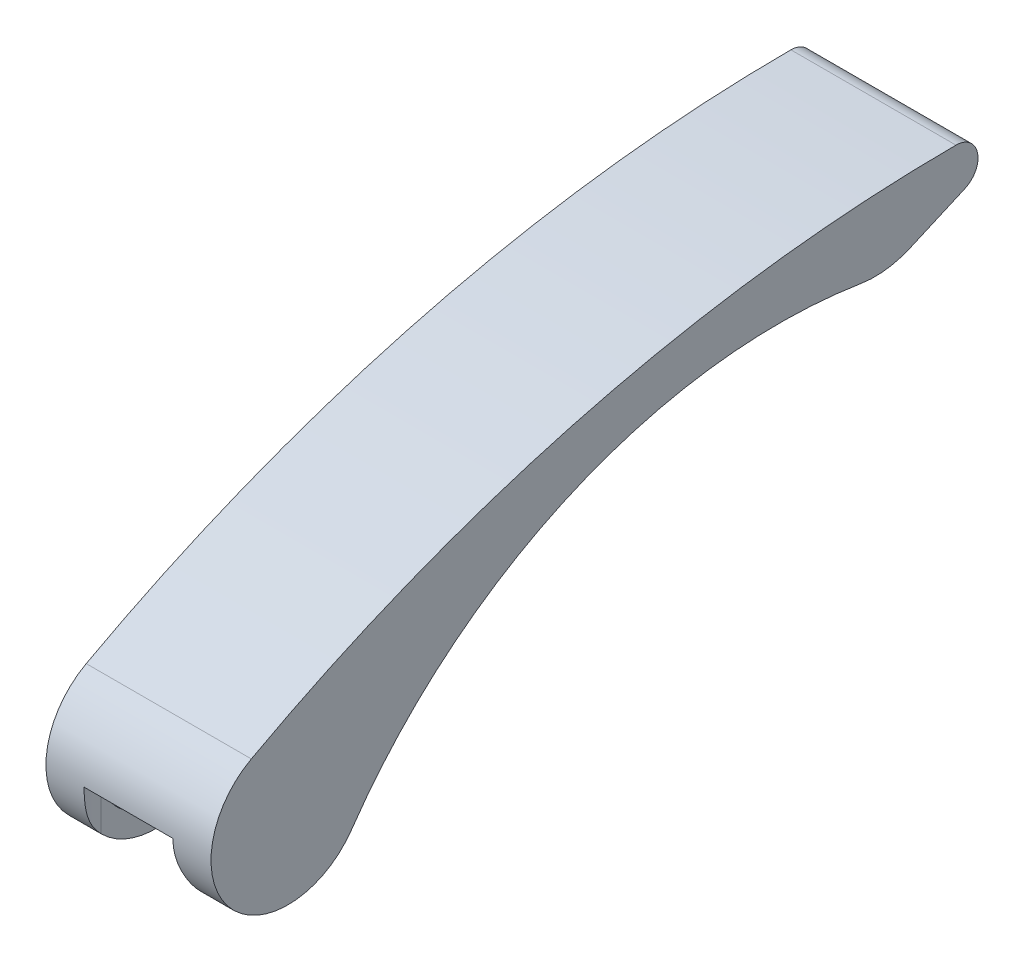
ISO-10303-21;
HEADER;
FILE_DESCRIPTION(('STEP AP214'),'2;1');
FILE_NAME('part.step','',(''),(''),'','','');
FILE_SCHEMA(('AUTOMOTIVE_DESIGN { 1 0 10303 214 1 1 1 1 }'));
ENDSEC;
DATA;
#1=APPLICATION_CONTEXT('core data for automotive mechanical design processes');
#2=APPLICATION_PROTOCOL_DEFINITION('international standard','automotive_design',2000,#1);
#3=PRODUCT_CONTEXT('',#1,'mechanical');
#4=PRODUCT('Part','Part','',(#3));
#5=PRODUCT_RELATED_PRODUCT_CATEGORY('part','',(#4));
#6=PRODUCT_DEFINITION_FORMATION('','',#4);
#7=PRODUCT_DEFINITION_CONTEXT('part definition',#1,'design');
#8=PRODUCT_DEFINITION('design','',#6,#7);
#9=PRODUCT_DEFINITION_SHAPE('','',#8);
#10=(LENGTH_UNIT() NAMED_UNIT(*) SI_UNIT(.MILLI.,.METRE.));
#11=(NAMED_UNIT(*) PLANE_ANGLE_UNIT() SI_UNIT($,.RADIAN.));
#12=(NAMED_UNIT(*) SI_UNIT($,.STERADIAN.) SOLID_ANGLE_UNIT());
#13=UNCERTAINTY_MEASURE_WITH_UNIT(LENGTH_MEASURE(1.E-05),#10,'distance_accuracy_value','');
#14=(GEOMETRIC_REPRESENTATION_CONTEXT(3) GLOBAL_UNCERTAINTY_ASSIGNED_CONTEXT((#13)) GLOBAL_UNIT_ASSIGNED_CONTEXT((#10,
#11,#12)) REPRESENTATION_CONTEXT('',''));
#15=CARTESIAN_POINT('',(0.,0.,0.));
#16=DIRECTION('',(0.,0.,1.));
#17=DIRECTION('',(1.,0.,0.));
#18=AXIS2_PLACEMENT_3D('',#15,#16,#17);
#19=CARTESIAN_POINT('',(7.5,0.,0.));
#20=DIRECTION('',(-1.,0.,0.));
#21=DIRECTION('',(0.,0.,1.));
#22=AXIS2_PLACEMENT_3D('',#19,#20,#21);
#23=CYLINDRICAL_SURFACE('',#22,2.5);
#24=CARTESIAN_POINT('',(6.,0.,0.));
#25=DIRECTION('',(-1.,0.,0.));
#26=DIRECTION('',(0.,0.,1.));
#27=AXIS2_PLACEMENT_3D('',#24,#25,#26);
#28=CIRCLE('',#27,2.5);
#29=CARTESIAN_POINT('',(6.,0.,-2.5));
#30=VERTEX_POINT('',#29);
#31=CARTESIAN_POINT('',(6.,0.,2.5));
#32=VERTEX_POINT('',#31);
#33=EDGE_CURVE('E137',#30,#32,#28,.T.);
#34=ORIENTED_EDGE('',*,*,#33,.T.);
#35=DIRECTION('',(-1.,0.,0.));
#36=VECTOR('',#35,1.);
#37=CARTESIAN_POINT('',(7.5,0.,2.5));
#38=LINE('',#37,#36);
#39=CARTESIAN_POINT('',(1.5,0.,2.5));
#40=VERTEX_POINT('',#39);
#41=EDGE_CURVE('E45',#32,#40,#38,.T.);
#42=ORIENTED_EDGE('',*,*,#41,.T.);
#43=CARTESIAN_POINT('',(1.5,0.,0.));
#44=DIRECTION('',(-1.,0.,0.));
#45=DIRECTION('',(0.,0.,1.));
#46=AXIS2_PLACEMENT_3D('',#43,#44,#45);
#47=CIRCLE('',#46,2.5);
#48=CARTESIAN_POINT('',(1.5,0.,-2.5));
#49=VERTEX_POINT('',#48);
#50=EDGE_CURVE('E163',#49,#40,#47,.T.);
#51=ORIENTED_EDGE('',*,*,#50,.F.);
#52=DIRECTION('',(-1.,0.,0.));
#53=VECTOR('',#52,1.);
#54=CARTESIAN_POINT('',(7.5,0.,-2.5));
#55=LINE('',#54,#53);
#56=EDGE_CURVE('E162',#49,#30,#55,.F.);
#57=ORIENTED_EDGE('',*,*,#56,.T.);
#58=EDGE_LOOP('',(#34,#42,#51,#57));
#59=FACE_BOUND('',#58,.T.);
#60=CARTESIAN_POINT('',(0.5,0.,0.));
#61=DIRECTION('',(1.,0.,0.));
#62=DIRECTION('',(0.,0.,-1.));
#63=AXIS2_PLACEMENT_3D('',#60,#61,#62);
#64=CIRCLE('',#63,2.5);
#65=CARTESIAN_POINT('',(0.5,0.,-2.5));
#66=VERTEX_POINT('',#65);
#67=EDGE_CURVE('E11',#66,#66,#64,.T.);
#68=ORIENTED_EDGE('',*,*,#67,.F.);
#69=EDGE_LOOP('',(#68));
#70=FACE_BOUND('',#69,.T.);
#71=CARTESIAN_POINT('',(7.,0.,0.));
#72=DIRECTION('',(1.,0.,0.));
#73=DIRECTION('',(0.,0.,-1.));
#74=AXIS2_PLACEMENT_3D('',#71,#72,#73);
#75=CIRCLE('',#74,2.5);
#76=CARTESIAN_POINT('',(7.,0.,-2.5));
#77=VERTEX_POINT('',#76);
#78=EDGE_CURVE('E329',#77,#77,#75,.T.);
#79=ORIENTED_EDGE('',*,*,#78,.T.);
#80=EDGE_LOOP('',(#79));
#81=FACE_BOUND('',#80,.T.);
#82=ADVANCED_FACE('F38',(#59,#70,#81),#23,.F.);
#83=CARTESIAN_POINT('',(7.5,0.,0.));
#84=DIRECTION('',(-1.,0.,0.));
#85=DIRECTION('',(0.,0.,1.));
#86=AXIS2_PLACEMENT_3D('',#83,#84,#85);
#87=CYLINDRICAL_SURFACE('',#86,3.50000000000001);
#88=CARTESIAN_POINT('',(1.5,-2.4494897427832,-2.5));
#89=CARTESIAN_POINT('',(1.50000055449243,-2.41359681335086,-2.5351700125889));
#90=CARTESIAN_POINT('',(1.50082451074234,-2.37694917305872,-2.56955989302334));
#91=CARTESIAN_POINT('',(1.50390141398077,-2.30233171537012,-2.63662204742708));
#92=CARTESIAN_POINT('',(1.50615088927806,-2.26436532137958,-2.66929828602822));
#93=CARTESIAN_POINT('',(1.51186295284461,-2.18712452422064,-2.73294552135876));
#94=CARTESIAN_POINT('',(1.51532547748346,-2.14785018975793,-2.76391660743322));
#95=CARTESIAN_POINT('',(1.52326815875585,-2.0679792368563,-2.82417629338434));
#96=CARTESIAN_POINT('',(1.52775076945461,-2.02737963529577,-2.85346061888814));
#97=CARTESIAN_POINT('',(1.53263650312109,-1.98620701639347,-2.8818365130641));
#98=B_SPLINE_CURVE_WITH_KNOTS('',3,(#88,#89,#90,#91,#92,#93,#94,#95,#96,#97),.UNSPECIFIED.,.F.,
.F.,(4,2,2,2,4),(0.,0.150726786481212,0.301087898176149,0.451441123871879,0.602159958095219),.UNSPECIFIED.);
#99=CARTESIAN_POINT('',(1.5,-2.4494897427832,-2.5));
#100=VERTEX_POINT('',#99);
#101=CARTESIAN_POINT('',(1.53263650312109,-1.98620701639347,-2.88183651306409));
#102=VERTEX_POINT('',#101);
#103=EDGE_CURVE('E203',#100,#102,#98,.T.);
#104=ORIENTED_EDGE('',*,*,#103,.F.);
#105=CARTESIAN_POINT('',(1.5,0.,0.));
#106=DIRECTION('',(-1.,0.,0.));
#107=DIRECTION('',(0.,0.,1.));
#108=AXIS2_PLACEMENT_3D('',#105,#106,#107);
#109=CIRCLE('',#108,3.50000000000001);
#110=CARTESIAN_POINT('',(1.5,-2.4494897427832,2.5));
#111=VERTEX_POINT('',#110);
#112=EDGE_CURVE('E311',#100,#111,#109,.T.);
#113=ORIENTED_EDGE('',*,*,#112,.T.);
#114=CARTESIAN_POINT('',(1.5,-2.4494897427832,2.5));
#115=CARTESIAN_POINT('',(1.50001150747874,-2.38095175548116,2.56717207436332));
#116=CARTESIAN_POINT('',(1.50300614509939,-2.30969610771905,2.63144440315893));
#117=CARTESIAN_POINT('',(1.51350734589181,-2.16244489518069,2.75371621954298));
#118=CARTESIAN_POINT('',(1.52100802104423,-2.08645563174073,2.81172377678419));
#119=CARTESIAN_POINT('',(1.53908086900067,-1.93019602662413,2.92120823654826));
#120=CARTESIAN_POINT('',(1.54965518951992,-1.84992272359693,2.97268053628989));
#121=CARTESIAN_POINT('',(1.57252869304207,-1.68564735207375,3.06882128421515));
#122=CARTESIAN_POINT('',(1.58482836705843,-1.6016442267858,3.11348778798106));
#123=CARTESIAN_POINT('',(1.62117544461668,-1.35282688823627,3.23304061150738));
#124=CARTESIAN_POINT('',(1.64580197505319,-1.18353586605966,3.298794881576));
#125=CARTESIAN_POINT('',(1.67785805000349,-0.923372687467986,3.37721661480882));
#126=CARTESIAN_POINT('',(1.68772324073695,-0.835689768159784,3.39997830220252));
#127=CARTESIAN_POINT('',(1.70504254564283,-0.658596393423089,3.43866987405277));
#128=CARTESIAN_POINT('',(1.71249767378733,-0.569186681321147,3.4546026325279));
#129=CARTESIAN_POINT('',(1.72362782614906,-0.399956808939108,3.47799274366245));
#130=CARTESIAN_POINT('',(1.72764796650892,-0.320266635163747,3.48623504444791));
#131=CARTESIAN_POINT('',(1.73306822255631,-0.160389663117444,3.49724328185141));
#132=CARTESIAN_POINT('',(1.73446728609904,-0.0802026783710895,3.5000070193068));
#133=CARTESIAN_POINT('',(1.73443556292537,0.,3.50000000000001));
#134=B_SPLINE_CURVE_WITH_KNOTS('',3,(#114,#115,#116,#117,#118,#119,#120,#121,#122,#123,#124,
#125,#126,#127,#128,#129,#130,#131,#132,#133),.UNSPECIFIED.,.F.,.F.,(4,2,2,2,2,2,2,2,2,4),(0.,
0.287643956036813,0.574912864047961,0.862382986258047,1.14993508537866,1.69714145381936,
1.97028821201802,2.24331990070184,2.48374413357205,2.7242648561567),.UNSPECIFIED.);
#135=CARTESIAN_POINT('',(1.73443556292537,0.,3.50000000000001));
#136=VERTEX_POINT('',#135);
#137=EDGE_CURVE('E263',#111,#136,#134,.T.);
#138=ORIENTED_EDGE('',*,*,#137,.T.);
#139=DIRECTION('',(-1.,0.,0.));
#140=VECTOR('',#139,1.);
#141=CARTESIAN_POINT('',(7.5,0.,3.50000000000001));
#142=LINE('',#141,#140);
#143=CARTESIAN_POINT('',(5.76556443707463,0.,3.50000000000001));
#144=VERTEX_POINT('',#143);
#145=EDGE_CURVE('E318',#144,#136,#142,.T.);
#146=ORIENTED_EDGE('',*,*,#145,.F.);
#147=CARTESIAN_POINT('',(5.76556443707463,0.,3.50000000000001));
#148=CARTESIAN_POINT('',(5.76556133534909,-0.0479260870665794,3.5000003669017));
#149=CARTESIAN_POINT('',(5.76605323889517,-0.0958454274084267,3.49901543521711));
#150=CARTESIAN_POINT('',(5.76799917922322,-0.191579894438586,3.49508112433821));
#151=CARTESIAN_POINT('',(5.76945313518614,-0.239395029542365,3.49213191015704));
#152=CARTESIAN_POINT('',(5.77521239050766,-0.382460549829141,3.48035501718148));
#153=CARTESIAN_POINT('',(5.78091518903482,-0.477431434342712,3.46859805913467));
#154=CARTESIAN_POINT('',(5.79549291115375,-0.665784628060411,3.4374179438071));
#155=CARTESIAN_POINT('',(5.80436604678452,-0.759167801644737,3.4179991069198));
#156=CARTESIAN_POINT('',(5.82443589802595,-0.943798363649761,3.37169206727653));
#157=CARTESIAN_POINT('',(5.83563293884035,-1.03504545115901,3.34480281894409));
#158=CARTESIAN_POINT('',(5.87032131704144,-1.2981974491666,3.25547777048318));
#159=CARTESIAN_POINT('',(5.89560113820167,-1.46660330151287,3.18317404250383));
#160=CARTESIAN_POINT('',(5.94248159644596,-1.79013745271599,3.01308612483012));
#161=CARTESIAN_POINT('',(5.96409150389626,-1.94529869905117,2.91536776516884));
#162=CARTESIAN_POINT('',(5.98553659621499,-2.15495204469237,2.75904295910474));
#163=CARTESIAN_POINT('',(5.99075429973335,-2.21620331139955,2.71009056157111));
#164=CARTESIAN_POINT('',(5.99798399917585,-2.33540400332939,2.60807367579205));
#165=CARTESIAN_POINT('',(5.99999504794763,-2.39335244812302,2.55500797744894));
#166=CARTESIAN_POINT('',(6.,-2.4494897427832,2.5));
#167=B_SPLINE_CURVE_WITH_KNOTS('',3,(#147,#148,#149,#150,#151,#152,#153,#154,#155,#156,#157,
#158,#159,#160,#161,#162,#163,#164,#165,#166),.UNSPECIFIED.,.F.,.F.,(4,2,2,2,2,2,2,2,2,4),(0.,
0.143752414921032,0.287492755181155,0.574673420829799,0.861692381449498,1.14875153417803,
1.70145191068032,2.25273467600519,2.48827314378283,2.72388116988002),.UNSPECIFIED.);
#168=CARTESIAN_POINT('',(6.,-2.4494897427832,2.5));
#169=VERTEX_POINT('',#168);
#170=EDGE_CURVE('E159',#144,#169,#167,.T.);
#171=ORIENTED_EDGE('',*,*,#170,.T.);
#172=CARTESIAN_POINT('',(6.,0.,0.));
#173=DIRECTION('',(-1.,0.,0.));
#174=DIRECTION('',(0.,0.,1.));
#175=AXIS2_PLACEMENT_3D('',#172,#173,#174);
#176=CIRCLE('',#175,3.50000000000001);
#177=CARTESIAN_POINT('',(6.,-2.4494897427832,-2.5));
#178=VERTEX_POINT('',#177);
#179=EDGE_CURVE('E140',#178,#169,#176,.T.);
#180=ORIENTED_EDGE('',*,*,#179,.F.);
#181=CARTESIAN_POINT('',(5.96736349687891,-1.98620701639347,-2.8818365130641));
#182=CARTESIAN_POINT('',(5.97224923054539,-2.02737963529577,-2.85346061888814));
#183=CARTESIAN_POINT('',(5.97673184124415,-2.0679792368563,-2.82417629338434));
#184=CARTESIAN_POINT('',(5.98467452251653,-2.14785018975793,-2.76391660743322));
#185=CARTESIAN_POINT('',(5.98813704715539,-2.18712452422064,-2.73294552135876));
#186=CARTESIAN_POINT('',(5.99384911072194,-2.26436532137958,-2.66929828602822));
#187=CARTESIAN_POINT('',(5.99609858601923,-2.30233171537012,-2.63662204742708));
#188=CARTESIAN_POINT('',(5.99917548925766,-2.37694917305872,-2.56955989302334));
#189=CARTESIAN_POINT('',(5.99999944550757,-2.41359681335086,-2.5351700125889));
#190=CARTESIAN_POINT('',(6.,-2.4494897427832,-2.5));
#191=B_SPLINE_CURVE_WITH_KNOTS('',3,(#181,#182,#183,#184,#185,#186,#187,#188,#189,#190),
.UNSPECIFIED.,.F.,.F.,(4,2,2,2,4),(0.,0.15071883422334,0.30107205991907,0.451433171614007,
0.60215995809522),.UNSPECIFIED.);
#192=CARTESIAN_POINT('',(5.96736349687891,-1.98620701639347,-2.88183651306409));
#193=VERTEX_POINT('',#192);
#194=EDGE_CURVE('E255',#193,#178,#191,.T.);
#195=ORIENTED_EDGE('',*,*,#194,.F.);
#196=DIRECTION('',(-1.,0.,0.));
#197=VECTOR('',#196,1.);
#198=CARTESIAN_POINT('',(7.5,-1.98620701639347,-2.8818365130641));
#199=LINE('',#198,#197);
#200=CARTESIAN_POINT('',(7.5,-1.98620701639347,-2.8818365130641));
#201=VERTEX_POINT('',#200);
#202=EDGE_CURVE('E175',#201,#193,#199,.T.);
#203=ORIENTED_EDGE('',*,*,#202,.F.);
#204=CARTESIAN_POINT('',(7.5,0.,0.));
#205=DIRECTION('',(1.,0.,0.));
#206=DIRECTION('',(0.,0.,-1.));
#207=AXIS2_PLACEMENT_3D('',#204,#205,#206);
#208=CIRCLE('',#207,3.50000000000001);
#209=CARTESIAN_POINT('',(7.5,3.07672550411426,1.66846041976817));
#210=VERTEX_POINT('',#209);
#211=EDGE_CURVE('E208',#210,#201,#208,.T.);
#212=ORIENTED_EDGE('',*,*,#211,.F.);
#213=DIRECTION('',(-1.,0.,0.));
#214=VECTOR('',#213,1.);
#215=CARTESIAN_POINT('',(7.5,3.07672550411426,1.66846041976817));
#216=LINE('',#215,#214);
#217=CARTESIAN_POINT('',(0.,3.07672550411426,1.66846041976817));
#218=VERTEX_POINT('',#217);
#219=EDGE_CURVE('E173',#210,#218,#216,.T.);
#220=ORIENTED_EDGE('',*,*,#219,.T.);
#221=CARTESIAN_POINT('',(0.,0.,0.));
#222=DIRECTION('',(1.,0.,0.));
#223=DIRECTION('',(0.,0.,-1.));
#224=AXIS2_PLACEMENT_3D('',#221,#222,#223);
#225=CIRCLE('',#224,3.50000000000001);
#226=CARTESIAN_POINT('',(0.,-1.98620701639347,-2.8818365130641));
#227=VERTEX_POINT('',#226);
#228=EDGE_CURVE('E191',#218,#227,#225,.T.);
#229=ORIENTED_EDGE('',*,*,#228,.T.);
#230=EDGE_CURVE('E178',#102,#227,#199,.T.);
#231=ORIENTED_EDGE('',*,*,#230,.F.);
#232=EDGE_LOOP('',(#104,#113,#138,#146,#171,#180,#195,#203,#212,#220,#229,#231));
#233=FACE_BOUND('',#232,.T.);
#234=ADVANCED_FACE('F231',(#233),#87,.T.);
#235=CARTESIAN_POINT('',(7.5,-15.384281348795,-22.3214314279843));
#236=DIRECTION('',(-1.,0.,0.));
#237=DIRECTION('',(0.,0.,1.));
#238=AXIS2_PLACEMENT_3D('',#235,#236,#237);
#239=CYLINDRICAL_SURFACE('',#238,23.6094524771912);
#240=CARTESIAN_POINT('',(1.53263650312109,-1.98620701639347,-2.88183651306409));
#241=CARTESIAN_POINT('',(1.540140264362,-1.92300970987465,-2.92539260466286));
#242=CARTESIAN_POINT('',(1.5489985173852,-1.86013813480697,-2.96917994973302));
#243=CARTESIAN_POINT('',(1.56960387392771,-1.73512074665356,-3.05715089198465));
#244=CARTESIAN_POINT('',(1.58135190783629,-1.67297517407375,-3.10133461235939));
#245=CARTESIAN_POINT('',(1.62131312644083,-1.48723765518741,-3.23474229161936));
#246=CARTESIAN_POINT('',(1.6541784153758,-1.3649224574917,-3.32442447625919));
#247=CARTESIAN_POINT('',(1.73223568860795,-1.13017613835719,-3.49997390014202));
#248=CARTESIAN_POINT('',(1.77683029448766,-1.01754646010371,-3.58583765642228));
#249=CARTESIAN_POINT('',(1.88055923373326,-0.798283159887392,-3.75603013859139));
#250=CARTESIAN_POINT('',(1.93966452602176,-0.691638078028816,-3.84036157351806));
#251=CARTESIAN_POINT('',(2.07852583315502,-0.480153244029879,-4.01043475838849));
#252=CARTESIAN_POINT('',(2.15928913791531,-0.375785627147139,-4.09596948619845));
#253=CARTESIAN_POINT('',(2.29716959556124,-0.227756564578017,-4.21921355132566));
#254=CARTESIAN_POINT('',(2.3465739992433,-0.179339037949922,-4.25987996082625));
#255=CARTESIAN_POINT('',(2.45121881991692,-0.0864760212990655,-4.33846359279002));
#256=CARTESIAN_POINT('',(2.50647168179277,-0.0420393885403822,-4.37637465106168));
#257=CARTESIAN_POINT('',(2.56472504343442,0.,-4.41249137967696));
#258=B_SPLINE_CURVE_WITH_KNOTS('',3,(#240,#241,#242,#243,#244,#245,#246,#247,#248,#249,#250,
#251,#252,#253,#254,#255,#256,#257),.UNSPECIFIED.,.F.,.F.,(4,2,2,2,2,2,2,2,4),(0.,
0.231331018278143,0.462736613233833,0.927655460684646,1.37238163669543,1.8162249102032,
2.28608137070408,2.52648808704797,2.76741705799169),.UNSPECIFIED.);
#259=CARTESIAN_POINT('',(2.56472504343448,0.,-4.41249137967694));
#260=VERTEX_POINT('',#259);
#261=EDGE_CURVE('E224',#102,#260,#258,.T.);
#262=ORIENTED_EDGE('',*,*,#261,.F.);
#263=ORIENTED_EDGE('',*,*,#230,.T.);
#264=CARTESIAN_POINT('',(0.,-15.384281348795,-22.3214314279843));
#265=DIRECTION('',(1.,0.,0.));
#266=DIRECTION('',(0.,0.,-1.));
#267=AXIS2_PLACEMENT_3D('',#264,#265,#266);
#268=CIRCLE('',#267,23.6094524771912);
#269=CARTESIAN_POINT('',(0.,7.9312784084232,-26.0350441542036));
#270=VERTEX_POINT('',#269);
#271=EDGE_CURVE('E188',#227,#270,#268,.F.);
#272=ORIENTED_EDGE('',*,*,#271,.T.);
#273=DIRECTION('',(-1.,0.,0.));
#274=VECTOR('',#273,1.);
#275=CARTESIAN_POINT('',(7.5,7.9312784084232,-26.0350441542036));
#276=LINE('',#275,#274);
#277=CARTESIAN_POINT('',(7.5,7.9312784084232,-26.0350441542036));
#278=VERTEX_POINT('',#277);
#279=EDGE_CURVE('E179',#278,#270,#276,.T.);
#280=ORIENTED_EDGE('',*,*,#279,.F.);
#281=CARTESIAN_POINT('',(7.5,-15.384281348795,-22.3214314279843));
#282=DIRECTION('',(1.,0.,0.));
#283=DIRECTION('',(0.,0.,-1.));
#284=AXIS2_PLACEMENT_3D('',#281,#282,#283);
#285=CIRCLE('',#284,23.6094524771912);
#286=EDGE_CURVE('E206',#201,#278,#285,.F.);
#287=ORIENTED_EDGE('',*,*,#286,.F.);
#288=ORIENTED_EDGE('',*,*,#202,.T.);
#289=CARTESIAN_POINT('',(4.93527495656552,0.,-4.41249137967694));
#290=CARTESIAN_POINT('',(5.00639277727953,-0.0513332194588065,-4.36838264582797));
#291=CARTESIAN_POINT('',(5.07303667517036,-0.10622381880041,-4.32162455605751));
#292=CARTESIAN_POINT('',(5.19761764279003,-0.221659712414828,-4.2242849943592));
#293=CARTESIAN_POINT('',(5.25558352453622,-0.282185161376225,-4.17371705202067));
#294=CARTESIAN_POINT('',(5.36214147377313,-0.406184981385888,-4.07124746672784));
#295=CARTESIAN_POINT('',(5.41093591833846,-0.469543819816011,-4.01941334951059));
#296=CARTESIAN_POINT('',(5.50153709932302,-0.599814696575874,-3.9140194360036));
#297=CARTESIAN_POINT('',(5.5433374284959,-0.66672991974876,-3.86045811041975));
#298=CARTESIAN_POINT('',(5.6351779028095,-0.829495084838799,-3.73167836234529));
#299=CARTESIAN_POINT('',(5.68227271967436,-0.926639855045424,-3.65599733938016));
#300=CARTESIAN_POINT('',(5.76545478149786,-1.12507531037512,-3.50396737667623));
#301=CARTESIAN_POINT('',(5.80153377132265,-1.22636904052745,-3.42761797992388));
#302=CARTESIAN_POINT('',(5.86502976998951,-1.43598821521534,-3.27231112306979));
#303=CARTESIAN_POINT('',(5.89206738712973,-1.54443470292546,-3.19336428537401));
#304=CARTESIAN_POINT('',(5.93657299670561,-1.76368188835896,-3.03662463314305));
#305=CARTESIAN_POINT('',(5.95406501135736,-1.87447594065935,-2.95882940552973));
#306=CARTESIAN_POINT('',(5.96736349687891,-1.98620701639347,-2.88183651306409));
#307=B_SPLINE_CURVE_WITH_KNOTS('',3,(#289,#290,#291,#292,#293,#294,#295,#296,#297,#298,#299,
#300,#301,#302,#303,#304,#305,#306),.UNSPECIFIED.,.F.,.F.,(4,2,2,2,2,2,2,2,4),(0.,
0.294051020078887,0.587103007531685,0.872634740535479,1.15842663122663,1.55330977391341,
1.94848811525204,2.3586186895508,2.76771232347809),.UNSPECIFIED.);
#308=CARTESIAN_POINT('',(4.93527495656552,0.,-4.41249137967694));
#309=VERTEX_POINT('',#308);
#310=EDGE_CURVE('E248',#309,#193,#307,.T.);
#311=ORIENTED_EDGE('',*,*,#310,.F.);
#312=DIRECTION('',(-1.,0.,0.));
#313=VECTOR('',#312,1.);
#314=CARTESIAN_POINT('',(7.5,0.,-4.41249137967694));
#315=LINE('',#314,#313);
#316=EDGE_CURVE('E317',#260,#309,#315,.F.);
#317=ORIENTED_EDGE('',*,*,#316,.F.);
#318=EDGE_LOOP('',(#262,#263,#272,#280,#287,#288,#311,#317));
#319=FACE_BOUND('',#318,.T.);
#320=ADVANCED_FACE('F301',(#319),#239,.F.);
#321=CARTESIAN_POINT('',(7.5,-3.49762272572137,-1.53255752001944));
#322=DIRECTION('',(0.,0.915931439398236,0.401334770885698));
#323=DIRECTION('',(0.,-0.401334770885698,0.915931439398236));
#324=AXIS2_PLACEMENT_3D('',#321,#322,#323);
#325=PLANE('',#324);
#326=DIRECTION('',(0.,0.401334770885698,-0.915931439398236));
#327=VECTOR('',#326,1.);
#328=CARTESIAN_POINT('',(0.,-3.49762272572137,-1.53255752001944));
#329=LINE('',#328,#327);
#330=CARTESIAN_POINT('',(0.,8.21776026868892,-28.2695571213521));
#331=VERTEX_POINT('',#330);
#332=CARTESIAN_POINT('',(0.,9.30305426109462,-30.746429201089));
#333=VERTEX_POINT('',#332);
#334=EDGE_CURVE('E200',#331,#333,#329,.T.);
#335=ORIENTED_EDGE('',*,*,#334,.T.);
#336=DIRECTION('',(-1.,0.,0.));
#337=VECTOR('',#336,1.);
#338=CARTESIAN_POINT('',(7.5,9.30305426109462,-30.746429201089));
#339=LINE('',#338,#337);
#340=CARTESIAN_POINT('',(7.5,9.30305426109462,-30.746429201089));
#341=VERTEX_POINT('',#340);
#342=EDGE_CURVE('E168',#341,#333,#339,.T.);
#343=ORIENTED_EDGE('',*,*,#342,.F.);
#344=DIRECTION('',(0.,0.401334770885698,-0.915931439398236));
#345=VECTOR('',#344,1.);
#346=CARTESIAN_POINT('',(7.5,-3.49762272572137,-1.53255752001944));
#347=LINE('',#346,#345);
#348=CARTESIAN_POINT('',(7.5,8.21776026868892,-28.2695571213521));
#349=VERTEX_POINT('',#348);
#350=EDGE_CURVE('E187',#349,#341,#347,.T.);
#351=ORIENTED_EDGE('',*,*,#350,.F.);
#352=DIRECTION('',(-1.,0.,0.));
#353=VECTOR('',#352,1.);
#354=CARTESIAN_POINT('',(7.5,8.21776026868892,-28.2695571213521));
#355=LINE('',#354,#353);
#356=EDGE_CURVE('E181',#349,#331,#355,.T.);
#357=ORIENTED_EDGE('',*,*,#356,.T.);
#358=EDGE_LOOP('',(#335,#343,#351,#357));
#359=FACE_BOUND('',#358,.T.);
#360=ADVANCED_FACE('F306',(#359),#325,.F.);
#361=CARTESIAN_POINT('',(7.5,10.2189857004929,-30.3450944302033));
#362=DIRECTION('',(-1.,0.,0.));
#363=DIRECTION('',(0.,0.,1.));
#364=AXIS2_PLACEMENT_3D('',#361,#362,#363);
#365=CYLINDRICAL_SURFACE('',#364,1.00000000000002);
#366=CARTESIAN_POINT('',(0.,10.2189857004929,-30.3450944302033));
#367=DIRECTION('',(1.,0.,0.));
#368=DIRECTION('',(0.,0.,-1.));
#369=AXIS2_PLACEMENT_3D('',#366,#367,#368);
#370=CIRCLE('',#369,1.00000000000002);
#371=CARTESIAN_POINT('',(0.,11.21898494099,-30.343861950915));
#372=VERTEX_POINT('',#371);
#373=EDGE_CURVE('E197',#333,#372,#370,.T.);
#374=ORIENTED_EDGE('',*,*,#373,.T.);
#375=DIRECTION('',(-1.,0.,0.));
#376=VECTOR('',#375,1.);
#377=CARTESIAN_POINT('',(7.5,11.21898494099,-30.343861950915));
#378=LINE('',#377,#376);
#379=CARTESIAN_POINT('',(7.5,11.21898494099,-30.343861950915));
#380=VERTEX_POINT('',#379);
#381=EDGE_CURVE('E171',#380,#372,#378,.T.);
#382=ORIENTED_EDGE('',*,*,#381,.F.);
#383=CARTESIAN_POINT('',(7.5,10.2189857004929,-30.3450944302033));
#384=DIRECTION('',(1.,0.,0.));
#385=DIRECTION('',(0.,0.,-1.));
#386=AXIS2_PLACEMENT_3D('',#383,#384,#385);
#387=CIRCLE('',#386,1.00000000000002);
#388=EDGE_CURVE('E213',#341,#380,#387,.T.);
#389=ORIENTED_EDGE('',*,*,#388,.F.);
#390=ORIENTED_EDGE('',*,*,#342,.T.);
#391=EDGE_LOOP('',(#374,#382,#389,#390));
#392=FACE_BOUND('',#391,.T.);
#393=ADVANCED_FACE('F445',(#392),#365,.T.);
#394=CARTESIAN_POINT('',(7.5,-56.108637290342,-30.4268419138725));
#395=DIRECTION('',(-1.,0.,0.));
#396=DIRECTION('',(0.,0.,1.));
#397=AXIS2_PLACEMENT_3D('',#394,#395,#396);
#398=CYLINDRICAL_SURFACE('',#397,67.3276733668943);
#399=CARTESIAN_POINT('',(0.,-56.108637290342,-30.4268419138725));
#400=DIRECTION('',(1.,0.,0.));
#401=DIRECTION('',(0.,0.,-1.));
#402=AXIS2_PLACEMENT_3D('',#399,#400,#401);
#403=CIRCLE('',#402,67.3276733668943);
#404=EDGE_CURVE('E194',#218,#372,#403,.F.);
#405=ORIENTED_EDGE('',*,*,#404,.F.);
#406=ORIENTED_EDGE('',*,*,#219,.F.);
#407=CARTESIAN_POINT('',(7.5,-56.108637290342,-30.4268419138725));
#408=DIRECTION('',(1.,0.,0.));
#409=DIRECTION('',(0.,0.,-1.));
#410=AXIS2_PLACEMENT_3D('',#407,#408,#409);
#411=CIRCLE('',#410,67.3276733668943);
#412=EDGE_CURVE('E210',#210,#380,#411,.F.);
#413=ORIENTED_EDGE('',*,*,#412,.T.);
#414=ORIENTED_EDGE('',*,*,#381,.T.);
#415=EDGE_LOOP('',(#405,#406,#413,#414));
#416=FACE_BOUND('',#415,.T.);
#417=ADVANCED_FACE('F437',(#416),#398,.T.);
#418=CARTESIAN_POINT('',(7.5,11.8814860262819,-26.6642180378093));
#419=DIRECTION('',(-1.,0.,0.));
#420=DIRECTION('',(0.,0.,1.));
#421=AXIS2_PLACEMENT_3D('',#418,#419,#420);
#422=CYLINDRICAL_SURFACE('',#421,4.);
#423=CARTESIAN_POINT('',(0.,11.8814860262819,-26.6642180378093));
#424=DIRECTION('',(1.,0.,0.));
#425=DIRECTION('',(0.,0.,-1.));
#426=AXIS2_PLACEMENT_3D('',#423,#424,#425);
#427=CIRCLE('',#426,4.);
#428=EDGE_CURVE('E184',#331,#270,#427,.F.);
#429=ORIENTED_EDGE('',*,*,#428,.F.);
#430=ORIENTED_EDGE('',*,*,#356,.F.);
#431=CARTESIAN_POINT('',(7.5,11.8814860262819,-26.6642180378093));
#432=DIRECTION('',(1.,0.,0.));
#433=DIRECTION('',(0.,0.,-1.));
#434=AXIS2_PLACEMENT_3D('',#431,#432,#433);
#435=CIRCLE('',#434,4.);
#436=EDGE_CURVE('E183',#349,#278,#435,.F.);
#437=ORIENTED_EDGE('',*,*,#436,.T.);
#438=ORIENTED_EDGE('',*,*,#279,.T.);
#439=EDGE_LOOP('',(#429,#430,#437,#438));
#440=FACE_BOUND('',#439,.T.);
#441=ADVANCED_FACE('F357',(#440),#422,.T.);
#442=CARTESIAN_POINT('',(7.5,0.,0.));
#443=DIRECTION('',(1.,0.,0.));
#444=DIRECTION('',(0.,0.,-1.));
#445=AXIS2_PLACEMENT_3D('',#442,#443,#444);
#446=PLANE('',#445);
#447=ORIENTED_EDGE('',*,*,#350,.T.);
#448=ORIENTED_EDGE('',*,*,#388,.T.);
#449=ORIENTED_EDGE('',*,*,#412,.F.);
#450=ORIENTED_EDGE('',*,*,#211,.T.);
#451=ORIENTED_EDGE('',*,*,#286,.T.);
#452=ORIENTED_EDGE('',*,*,#436,.F.);
#453=EDGE_LOOP('',(#447,#448,#449,#450,#451,#452));
#454=FACE_BOUND('',#453,.T.);
#455=ADVANCED_FACE('F243',(#454),#446,.T.);
#456=CARTESIAN_POINT('',(0.,0.,0.));
#457=DIRECTION('',(1.,0.,0.));
#458=DIRECTION('',(0.,0.,-1.));
#459=AXIS2_PLACEMENT_3D('',#456,#457,#458);
#460=PLANE('',#459);
#461=ORIENTED_EDGE('',*,*,#334,.F.);
#462=ORIENTED_EDGE('',*,*,#428,.T.);
#463=ORIENTED_EDGE('',*,*,#271,.F.);
#464=ORIENTED_EDGE('',*,*,#228,.F.);
#465=ORIENTED_EDGE('',*,*,#404,.T.);
#466=ORIENTED_EDGE('',*,*,#373,.F.);
#467=EDGE_LOOP('',(#461,#462,#463,#464,#465,#466));
#468=FACE_BOUND('',#467,.T.);
#469=ADVANCED_FACE('F240',(#468),#460,.F.);
#470=CARTESIAN_POINT('',(3.75,-3.50000000000001,-2.5));
#471=DIRECTION('',(0.,1.,0.));
#472=DIRECTION('',(0.,0.,1.));
#473=AXIS2_PLACEMENT_3D('',#470,#471,#472);
#474=CYLINDRICAL_SURFACE('',#473,2.25);
#475=ORIENTED_EDGE('',*,*,#103,.T.);
#476=ORIENTED_EDGE('',*,*,#261,.T.);
#477=CARTESIAN_POINT('',(3.75,0.,-2.5));
#478=DIRECTION('',(0.,-1.,0.));
#479=DIRECTION('',(0.,0.,-1.));
#480=AXIS2_PLACEMENT_3D('',#477,#478,#479);
#481=CIRCLE('',#480,2.25);
#482=EDGE_CURVE('E52',#49,#260,#481,.T.);
#483=ORIENTED_EDGE('',*,*,#482,.F.);
#484=DIRECTION('',(0.,1.,0.));
#485=VECTOR('',#484,1.);
#486=CARTESIAN_POINT('',(1.5,-3.50000000000001,-2.5));
#487=LINE('',#486,#485);
#488=EDGE_CURVE('E316',#100,#49,#487,.T.);
#489=ORIENTED_EDGE('',*,*,#488,.F.);
#490=EDGE_LOOP('',(#475,#476,#483,#489));
#491=FACE_BOUND('',#490,.T.);
#492=ADVANCED_FACE('F234',(#491),#474,.F.);
#493=ORIENTED_EDGE('',*,*,#194,.T.);
#494=DIRECTION('',(0.,1.,0.));
#495=VECTOR('',#494,1.);
#496=CARTESIAN_POINT('',(6.,-3.50000000000001,-2.5));
#497=LINE('',#496,#495);
#498=EDGE_CURVE('E144',#178,#30,#497,.T.);
#499=ORIENTED_EDGE('',*,*,#498,.T.);
#500=EDGE_CURVE('E57',#309,#30,#481,.T.);
#501=ORIENTED_EDGE('',*,*,#500,.F.);
#502=ORIENTED_EDGE('',*,*,#310,.T.);
#503=EDGE_LOOP('',(#493,#499,#501,#502));
#504=FACE_BOUND('',#503,.T.);
#505=ADVANCED_FACE('F239',(#504),#474,.F.);
#506=CARTESIAN_POINT('',(6.,-3.50000000000001,-2.5));
#507=DIRECTION('',(-1.,0.,0.));
#508=DIRECTION('',(0.,0.,1.));
#509=AXIS2_PLACEMENT_3D('',#506,#507,#508);
#510=PLANE('',#509);
#511=ORIENTED_EDGE('',*,*,#179,.T.);
#512=DIRECTION('',(0.,1.,0.));
#513=VECTOR('',#512,1.);
#514=CARTESIAN_POINT('',(6.,-3.50000000000001,2.5));
#515=LINE('',#514,#513);
#516=EDGE_CURVE('E132',#169,#32,#515,.T.);
#517=ORIENTED_EDGE('',*,*,#516,.T.);
#518=ORIENTED_EDGE('',*,*,#33,.F.);
#519=ORIENTED_EDGE('',*,*,#498,.F.);
#520=EDGE_LOOP('',(#511,#517,#518,#519));
#521=FACE_BOUND('',#520,.T.);
#522=ADVANCED_FACE('F134',(#521),#510,.T.);
#523=CARTESIAN_POINT('',(3.75,-3.50000000000001,2.5));
#524=DIRECTION('',(0.,1.,0.));
#525=DIRECTION('',(0.,0.,1.));
#526=AXIS2_PLACEMENT_3D('',#523,#524,#525);
#527=CYLINDRICAL_SURFACE('',#526,2.25);
#528=CARTESIAN_POINT('',(3.75,0.,2.5));
#529=DIRECTION('',(0.,1.,0.));
#530=DIRECTION('',(0.,0.,1.));
#531=AXIS2_PLACEMENT_3D('',#528,#529,#530);
#532=CIRCLE('',#531,2.25);
#533=EDGE_CURVE('E152',#144,#32,#532,.T.);
#534=ORIENTED_EDGE('',*,*,#533,.T.);
#535=ORIENTED_EDGE('',*,*,#516,.F.);
#536=ORIENTED_EDGE('',*,*,#170,.F.);
#537=EDGE_LOOP('',(#534,#535,#536));
#538=FACE_BOUND('',#537,.T.);
#539=ADVANCED_FACE('F158',(#538),#527,.F.);
#540=DIRECTION('',(0.,1.,0.));
#541=VECTOR('',#540,1.);
#542=CARTESIAN_POINT('',(1.5,-3.50000000000001,2.5));
#543=LINE('',#542,#541);
#544=EDGE_CURVE('E145',#111,#40,#543,.T.);
#545=ORIENTED_EDGE('',*,*,#544,.T.);
#546=EDGE_CURVE('E155',#40,#136,#532,.T.);
#547=ORIENTED_EDGE('',*,*,#546,.T.);
#548=ORIENTED_EDGE('',*,*,#137,.F.);
#549=EDGE_LOOP('',(#545,#547,#548));
#550=FACE_BOUND('',#549,.T.);
#551=ADVANCED_FACE('F278',(#550),#527,.F.);
#552=CARTESIAN_POINT('',(1.5,-3.50000000000001,-2.5));
#553=DIRECTION('',(-1.,0.,0.));
#554=DIRECTION('',(0.,0.,1.));
#555=AXIS2_PLACEMENT_3D('',#552,#553,#554);
#556=PLANE('',#555);
#557=ORIENTED_EDGE('',*,*,#488,.T.);
#558=ORIENTED_EDGE('',*,*,#50,.T.);
#559=ORIENTED_EDGE('',*,*,#544,.F.);
#560=ORIENTED_EDGE('',*,*,#112,.F.);
#561=EDGE_LOOP('',(#557,#558,#559,#560));
#562=FACE_BOUND('',#561,.T.);
#563=ADVANCED_FACE('F279',(#562),#556,.F.);
#564=CARTESIAN_POINT('',(3.75,0.,-2.5));
#565=DIRECTION('',(0.,-1.,0.));
#566=DIRECTION('',(0.,0.,-1.));
#567=AXIS2_PLACEMENT_3D('',#564,#565,#566);
#568=PLANE('',#567);
#569=ORIENTED_EDGE('',*,*,#145,.T.);
#570=ORIENTED_EDGE('',*,*,#546,.F.);
#571=ORIENTED_EDGE('',*,*,#41,.F.);
#572=ORIENTED_EDGE('',*,*,#533,.F.);
#573=EDGE_LOOP('',(#569,#570,#571,#572));
#574=FACE_BOUND('',#573,.T.);
#575=ADVANCED_FACE('F151',(#574),#568,.T.);
#576=ORIENTED_EDGE('',*,*,#316,.T.);
#577=ORIENTED_EDGE('',*,*,#500,.T.);
#578=ORIENTED_EDGE('',*,*,#56,.F.);
#579=ORIENTED_EDGE('',*,*,#482,.T.);
#580=EDGE_LOOP('',(#576,#577,#578,#579));
#581=FACE_BOUND('',#580,.T.);
#582=ADVANCED_FACE('F286',(#581),#568,.T.);
#583=CARTESIAN_POINT('',(0.5,0.,0.));
#584=DIRECTION('',(1.,0.,0.));
#585=DIRECTION('',(0.,0.,-1.));
#586=AXIS2_PLACEMENT_3D('',#583,#584,#585);
#587=PLANE('',#586);
#588=ORIENTED_EDGE('',*,*,#67,.T.);
#589=EDGE_LOOP('',(#588));
#590=FACE_BOUND('',#589,.T.);
#591=ADVANCED_FACE('F287',(#590),#587,.T.);
#592=CARTESIAN_POINT('',(7.,0.,0.));
#593=DIRECTION('',(1.,0.,0.));
#594=DIRECTION('',(0.,0.,-1.));
#595=AXIS2_PLACEMENT_3D('',#592,#593,#594);
#596=PLANE('',#595);
#597=ORIENTED_EDGE('',*,*,#78,.F.);
#598=EDGE_LOOP('',(#597));
#599=FACE_BOUND('',#598,.T.);
#600=ADVANCED_FACE('F290',(#599),#596,.F.);
#601=CLOSED_SHELL('',(#82,#234,#320,#360,#393,#417,#441,#455,#469,#492,#505,#522,#539,#551,#563,
#575,#582,#591,#600));
#602=MANIFOLD_SOLID_BREP('B2',#601);
#603=ADVANCED_BREP_SHAPE_REPRESENTATION('',(#18,#602),#14);
#604=SHAPE_DEFINITION_REPRESENTATION(#9,#603);
ENDSEC;
END-ISO-10303-21;
